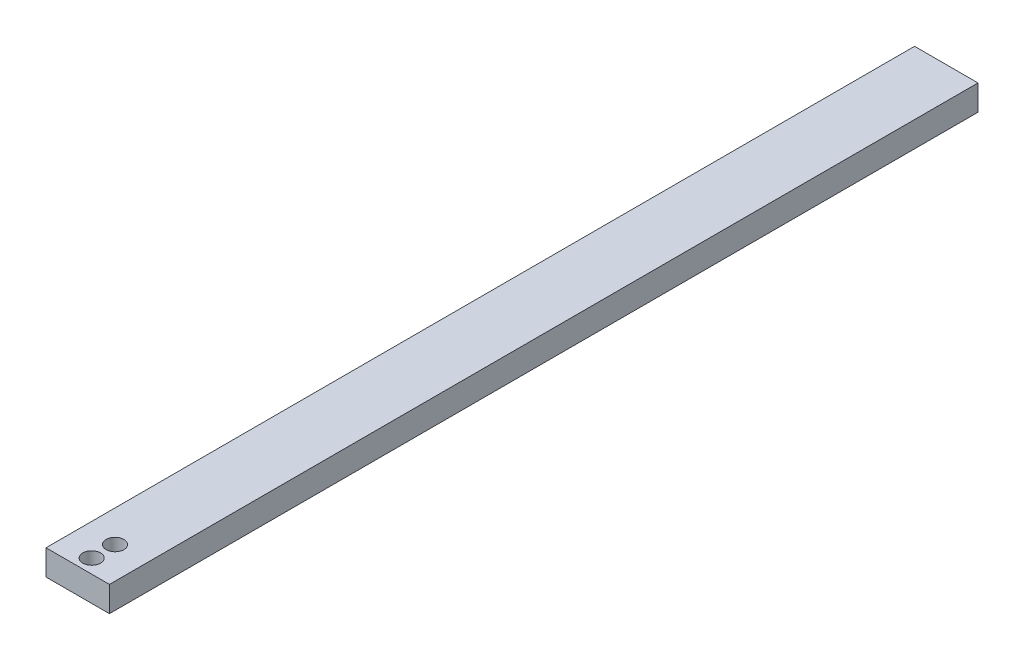
ISO-10303-21;
HEADER;
FILE_DESCRIPTION(('STEP AP214'),'2;1');
FILE_NAME('part.step','',(''),(''),'','','');
FILE_SCHEMA(('AUTOMOTIVE_DESIGN { 1 0 10303 214 1 1 1 1 }'));
ENDSEC;
DATA;
#1=APPLICATION_CONTEXT('core data for automotive mechanical design processes');
#2=APPLICATION_PROTOCOL_DEFINITION('international standard','automotive_design',2000,#1);
#3=PRODUCT_CONTEXT('',#1,'mechanical');
#4=PRODUCT('Part','Part','',(#3));
#5=PRODUCT_RELATED_PRODUCT_CATEGORY('part','',(#4));
#6=PRODUCT_DEFINITION_FORMATION('','',#4);
#7=PRODUCT_DEFINITION_CONTEXT('part definition',#1,'design');
#8=PRODUCT_DEFINITION('design','',#6,#7);
#9=PRODUCT_DEFINITION_SHAPE('','',#8);
#10=(LENGTH_UNIT() NAMED_UNIT(*) SI_UNIT(.MILLI.,.METRE.));
#11=(NAMED_UNIT(*) PLANE_ANGLE_UNIT() SI_UNIT($,.RADIAN.));
#12=(NAMED_UNIT(*) SI_UNIT($,.STERADIAN.) SOLID_ANGLE_UNIT());
#13=UNCERTAINTY_MEASURE_WITH_UNIT(LENGTH_MEASURE(1.E-05),#10,'distance_accuracy_value','');
#14=(GEOMETRIC_REPRESENTATION_CONTEXT(3) GLOBAL_UNCERTAINTY_ASSIGNED_CONTEXT((#13)) GLOBAL_UNIT_ASSIGNED_CONTEXT((#10,
#11,#12)) REPRESENTATION_CONTEXT('',''));
#15=CARTESIAN_POINT('',(0.,0.,0.));
#16=DIRECTION('',(0.,0.,1.));
#17=DIRECTION('',(1.,0.,0.));
#18=AXIS2_PLACEMENT_3D('',#15,#16,#17);
#19=CARTESIAN_POINT('',(-82.2085889570552,28.3742331288343,684.5));
#20=DIRECTION('',(1.,0.,0.));
#21=DIRECTION('',(0.,1.,0.));
#22=AXIS2_PLACEMENT_3D('',#19,#20,#21);
#23=PLANE('',#22);
#24=DIRECTION('',(0.,-1.,0.));
#25=VECTOR('',#24,1.);
#26=CARTESIAN_POINT('',(-82.2085889570552,28.3742331288343,0.));
#27=LINE('',#26,#25);
#28=CARTESIAN_POINT('',(-82.2085889570552,28.3742331288343,0.));
#29=VERTEX_POINT('',#28);
#30=CARTESIAN_POINT('',(-82.2085889570552,8.37423312883434,0.));
#31=VERTEX_POINT('',#30);
#32=EDGE_CURVE('E107',#29,#31,#27,.T.);
#33=ORIENTED_EDGE('',*,*,#32,.T.);
#34=DIRECTION('',(0.,0.,-1.));
#35=VECTOR('',#34,1.);
#36=CARTESIAN_POINT('',(-82.2085889570552,8.37423312883434,684.5));
#37=LINE('',#36,#35);
#38=CARTESIAN_POINT('',(-82.2085889570552,8.37423312883434,684.5));
#39=VERTEX_POINT('',#38);
#40=EDGE_CURVE('E11',#39,#31,#37,.T.);
#41=ORIENTED_EDGE('',*,*,#40,.F.);
#42=DIRECTION('',(0.,-1.,0.));
#43=VECTOR('',#42,1.);
#44=CARTESIAN_POINT('',(-82.2085889570552,28.3742331288343,684.5));
#45=LINE('',#44,#43);
#46=CARTESIAN_POINT('',(-82.2085889570552,28.3742331288343,684.5));
#47=VERTEX_POINT('',#46);
#48=EDGE_CURVE('E94',#47,#39,#45,.T.);
#49=ORIENTED_EDGE('',*,*,#48,.F.);
#50=DIRECTION('',(0.,0.,-1.));
#51=VECTOR('',#50,1.);
#52=CARTESIAN_POINT('',(-82.2085889570552,28.3742331288343,684.5));
#53=LINE('',#52,#51);
#54=EDGE_CURVE('E103',#47,#29,#53,.T.);
#55=ORIENTED_EDGE('',*,*,#54,.T.);
#56=EDGE_LOOP('',(#33,#41,#49,#55));
#57=FACE_BOUND('',#56,.T.);
#58=ADVANCED_FACE('F41',(#57),#23,.F.);
#59=CARTESIAN_POINT('',(-82.2085889570552,8.37423312883434,684.5));
#60=DIRECTION('',(0.,1.,0.));
#61=DIRECTION('',(0.,0.,1.));
#62=AXIS2_PLACEMENT_3D('',#59,#60,#61);
#63=PLANE('',#62);
#64=CARTESIAN_POINT('',(-57.2085889570552,8.37423312883434,673.5));
#65=DIRECTION('',(0.,1.,0.));
#66=DIRECTION('',(0.,0.,1.));
#67=AXIS2_PLACEMENT_3D('',#64,#65,#66);
#68=CIRCLE('',#67,7.);
#69=CARTESIAN_POINT('',(-57.2085889570552,8.37423312883434,680.5));
#70=VERTEX_POINT('',#69);
#71=EDGE_CURVE('E116',#70,#70,#68,.T.);
#72=ORIENTED_EDGE('',*,*,#71,.T.);
#73=EDGE_LOOP('',(#72));
#74=FACE_BOUND('',#73,.T.);
#75=CARTESIAN_POINT('',(-57.2085889570552,8.37423312883434,655.1));
#76=DIRECTION('',(0.,1.,0.));
#77=DIRECTION('',(0.,0.,1.));
#78=AXIS2_PLACEMENT_3D('',#75,#76,#77);
#79=CIRCLE('',#78,7.);
#80=CARTESIAN_POINT('',(-57.2085889570552,8.37423312883434,662.1));
#81=VERTEX_POINT('',#80);
#82=EDGE_CURVE('E121',#81,#81,#79,.T.);
#83=ORIENTED_EDGE('',*,*,#82,.T.);
#84=EDGE_LOOP('',(#83));
#85=FACE_BOUND('',#84,.T.);
#86=DIRECTION('',(1.,0.,0.));
#87=VECTOR('',#86,1.);
#88=CARTESIAN_POINT('',(-82.2085889570552,8.37423312883434,0.));
#89=LINE('',#88,#87);
#90=CARTESIAN_POINT('',(-32.2085889570552,8.37423312883434,0.));
#91=VERTEX_POINT('',#90);
#92=EDGE_CURVE('E98',#31,#91,#89,.T.);
#93=ORIENTED_EDGE('',*,*,#92,.T.);
#94=DIRECTION('',(0.,0.,-1.));
#95=VECTOR('',#94,1.);
#96=CARTESIAN_POINT('',(-32.2085889570552,8.37423312883434,684.5));
#97=LINE('',#96,#95);
#98=CARTESIAN_POINT('',(-32.2085889570552,8.37423312883434,684.5));
#99=VERTEX_POINT('',#98);
#100=EDGE_CURVE('E50',#99,#91,#97,.T.);
#101=ORIENTED_EDGE('',*,*,#100,.F.);
#102=DIRECTION('',(1.,0.,0.));
#103=VECTOR('',#102,1.);
#104=CARTESIAN_POINT('',(-82.2085889570552,8.37423312883434,684.5));
#105=LINE('',#104,#103);
#106=EDGE_CURVE('E89',#39,#99,#105,.T.);
#107=ORIENTED_EDGE('',*,*,#106,.F.);
#108=ORIENTED_EDGE('',*,*,#40,.T.);
#109=EDGE_LOOP('',(#93,#101,#107,#108));
#110=FACE_BOUND('',#109,.T.);
#111=ADVANCED_FACE('F97',(#74,#85,#110),#63,.F.);
#112=CARTESIAN_POINT('',(-32.2085889570552,28.3742331288343,684.5));
#113=DIRECTION('',(-1.,0.,0.));
#114=DIRECTION('',(0.,0.,1.));
#115=AXIS2_PLACEMENT_3D('',#112,#113,#114);
#116=PLANE('',#115);
#117=DIRECTION('',(0.,1.,0.));
#118=VECTOR('',#117,1.);
#119=CARTESIAN_POINT('',(-32.2085889570552,28.3742331288343,0.));
#120=LINE('',#119,#118);
#121=CARTESIAN_POINT('',(-32.2085889570552,28.3742331288343,0.));
#122=VERTEX_POINT('',#121);
#123=EDGE_CURVE('E76',#91,#122,#120,.T.);
#124=ORIENTED_EDGE('',*,*,#123,.T.);
#125=DIRECTION('',(0.,0.,-1.));
#126=VECTOR('',#125,1.);
#127=CARTESIAN_POINT('',(-32.2085889570552,28.3742331288343,684.5));
#128=LINE('',#127,#126);
#129=CARTESIAN_POINT('',(-32.2085889570552,28.3742331288343,684.5));
#130=VERTEX_POINT('',#129);
#131=EDGE_CURVE('E99',#130,#122,#128,.T.);
#132=ORIENTED_EDGE('',*,*,#131,.F.);
#133=DIRECTION('',(0.,1.,0.));
#134=VECTOR('',#133,1.);
#135=CARTESIAN_POINT('',(-32.2085889570552,28.3742331288343,684.5));
#136=LINE('',#135,#134);
#137=EDGE_CURVE('E92',#99,#130,#136,.T.);
#138=ORIENTED_EDGE('',*,*,#137,.F.);
#139=ORIENTED_EDGE('',*,*,#100,.T.);
#140=EDGE_LOOP('',(#124,#132,#138,#139));
#141=FACE_BOUND('',#140,.T.);
#142=ADVANCED_FACE('F101',(#141),#116,.F.);
#143=CARTESIAN_POINT('',(-82.2085889570552,28.3742331288343,684.5));
#144=DIRECTION('',(0.,-1.,0.));
#145=DIRECTION('',(0.,0.,-1.));
#146=AXIS2_PLACEMENT_3D('',#143,#144,#145);
#147=PLANE('',#146);
#148=CARTESIAN_POINT('',(-57.2085889570552,28.3742331288343,673.5));
#149=DIRECTION('',(0.,-1.,0.));
#150=DIRECTION('',(0.,0.,-1.));
#151=AXIS2_PLACEMENT_3D('',#148,#149,#150);
#152=CIRCLE('',#151,7.);
#153=CARTESIAN_POINT('',(-57.2085889570552,28.3742331288343,666.5));
#154=VERTEX_POINT('',#153);
#155=EDGE_CURVE('E44',#154,#154,#152,.T.);
#156=ORIENTED_EDGE('',*,*,#155,.T.);
#157=EDGE_LOOP('',(#156));
#158=FACE_BOUND('',#157,.T.);
#159=CARTESIAN_POINT('',(-57.2085889570552,28.3742331288343,655.1));
#160=DIRECTION('',(0.,-1.,0.));
#161=DIRECTION('',(0.,0.,-1.));
#162=AXIS2_PLACEMENT_3D('',#159,#160,#161);
#163=CIRCLE('',#162,7.);
#164=CARTESIAN_POINT('',(-57.2085889570552,28.3742331288343,648.1));
#165=VERTEX_POINT('',#164);
#166=EDGE_CURVE('E114',#165,#165,#163,.T.);
#167=ORIENTED_EDGE('',*,*,#166,.T.);
#168=EDGE_LOOP('',(#167));
#169=FACE_BOUND('',#168,.T.);
#170=DIRECTION('',(-1.,0.,0.));
#171=VECTOR('',#170,1.);
#172=CARTESIAN_POINT('',(-82.2085889570552,28.3742331288343,0.));
#173=LINE('',#172,#171);
#174=EDGE_CURVE('E82',#122,#29,#173,.T.);
#175=ORIENTED_EDGE('',*,*,#174,.T.);
#176=ORIENTED_EDGE('',*,*,#54,.F.);
#177=DIRECTION('',(-1.,0.,0.));
#178=VECTOR('',#177,1.);
#179=CARTESIAN_POINT('',(-82.2085889570552,28.3742331288343,684.5));
#180=LINE('',#179,#178);
#181=EDGE_CURVE('E59',#130,#47,#180,.T.);
#182=ORIENTED_EDGE('',*,*,#181,.F.);
#183=ORIENTED_EDGE('',*,*,#131,.T.);
#184=EDGE_LOOP('',(#175,#176,#182,#183));
#185=FACE_BOUND('',#184,.T.);
#186=ADVANCED_FACE('F151',(#158,#169,#185),#147,.F.);
#187=CARTESIAN_POINT('',(0.,0.,684.5));
#188=DIRECTION('',(0.,0.,1.));
#189=DIRECTION('',(1.,0.,0.));
#190=AXIS2_PLACEMENT_3D('',#187,#188,#189);
#191=PLANE('',#190);
#192=ORIENTED_EDGE('',*,*,#48,.T.);
#193=ORIENTED_EDGE('',*,*,#106,.T.);
#194=ORIENTED_EDGE('',*,*,#137,.T.);
#195=ORIENTED_EDGE('',*,*,#181,.T.);
#196=EDGE_LOOP('',(#192,#193,#194,#195));
#197=FACE_BOUND('',#196,.T.);
#198=ADVANCED_FACE('F90',(#197),#191,.T.);
#199=CARTESIAN_POINT('',(0.,0.,0.));
#200=DIRECTION('',(0.,0.,1.));
#201=DIRECTION('',(1.,0.,0.));
#202=AXIS2_PLACEMENT_3D('',#199,#200,#201);
#203=PLANE('',#202);
#204=CARTESIAN_POINT('',(-57.2085889570552,18.3742331288343,0.));
#205=DIRECTION('',(0.,0.,-1.));
#206=DIRECTION('',(-1.,0.,0.));
#207=AXIS2_PLACEMENT_3D('',#204,#205,#206);
#208=CIRCLE('',#207,6.99999999999999);
#209=CARTESIAN_POINT('',(-64.2085889570552,18.3742331288343,0.));
#210=VERTEX_POINT('',#209);
#211=EDGE_CURVE('E129',#210,#210,#208,.T.);
#212=ORIENTED_EDGE('',*,*,#211,.F.);
#213=EDGE_LOOP('',(#212));
#214=FACE_BOUND('',#213,.T.);
#215=ORIENTED_EDGE('',*,*,#32,.F.);
#216=ORIENTED_EDGE('',*,*,#174,.F.);
#217=ORIENTED_EDGE('',*,*,#123,.F.);
#218=ORIENTED_EDGE('',*,*,#92,.F.);
#219=EDGE_LOOP('',(#215,#216,#217,#218));
#220=FACE_BOUND('',#219,.T.);
#221=ADVANCED_FACE('F144',(#214,#220),#203,.F.);
#222=CARTESIAN_POINT('',(-57.2085889570552,8.37423312883434,655.1));
#223=DIRECTION('',(0.,1.,0.));
#224=DIRECTION('',(0.,0.,1.));
#225=AXIS2_PLACEMENT_3D('',#222,#223,#224);
#226=CYLINDRICAL_SURFACE('',#225,7.);
#227=ORIENTED_EDGE('',*,*,#82,.F.);
#228=EDGE_LOOP('',(#227));
#229=FACE_BOUND('',#228,.T.);
#230=ORIENTED_EDGE('',*,*,#166,.F.);
#231=EDGE_LOOP('',(#230));
#232=FACE_BOUND('',#231,.T.);
#233=ADVANCED_FACE('F147',(#229,#232),#226,.F.);
#234=CARTESIAN_POINT('',(-57.2085889570552,8.37423312883434,673.5));
#235=DIRECTION('',(0.,1.,0.));
#236=DIRECTION('',(0.,0.,1.));
#237=AXIS2_PLACEMENT_3D('',#234,#235,#236);
#238=CYLINDRICAL_SURFACE('',#237,7.);
#239=ORIENTED_EDGE('',*,*,#71,.F.);
#240=EDGE_LOOP('',(#239));
#241=FACE_BOUND('',#240,.T.);
#242=ORIENTED_EDGE('',*,*,#155,.F.);
#243=EDGE_LOOP('',(#242));
#244=FACE_BOUND('',#243,.T.);
#245=ADVANCED_FACE('F140',(#241,#244),#238,.F.);
#246=CARTESIAN_POINT('',(-57.2085889570552,18.3742331288343,14.));
#247=DIRECTION('',(0.,0.,-1.));
#248=DIRECTION('',(-1.,0.,0.));
#249=AXIS2_PLACEMENT_3D('',#246,#247,#248);
#250=CYLINDRICAL_SURFACE('',#249,6.99999999999999);
#251=CARTESIAN_POINT('',(-57.2085889570552,18.3742331288343,14.));
#252=DIRECTION('',(0.,0.,-1.));
#253=DIRECTION('',(-1.,0.,0.));
#254=AXIS2_PLACEMENT_3D('',#251,#252,#253);
#255=CIRCLE('',#254,6.99999999999999);
#256=CARTESIAN_POINT('',(-64.2085889570552,18.3742331288343,14.));
#257=VERTEX_POINT('',#256);
#258=EDGE_CURVE('E126',#257,#257,#255,.T.);
#259=CARTESIAN_POINT('',(-64.2085889570552,18.3742331288343,14.));
#260=CARTESIAN_POINT('',(-64.2085889570552,18.3742331288343,13.8541666666667));
#261=CARTESIAN_POINT('',(-64.2085889570552,18.3742331288343,13.7083333333333));
#262=CARTESIAN_POINT('',(-64.2085889570552,18.3742331288343,13.4166666666667));
#263=CARTESIAN_POINT('',(-64.2085889570552,18.3742331288343,13.2708333333333));
#264=CARTESIAN_POINT('',(-64.2085889570552,18.3742331288343,12.9791666666667));
#265=CARTESIAN_POINT('',(-64.2085889570552,18.3742331288343,12.8333333333333));
#266=CARTESIAN_POINT('',(-64.2085889570552,18.3742331288343,12.5416666666667));
#267=CARTESIAN_POINT('',(-64.2085889570552,18.3742331288343,12.3958333333333));
#268=CARTESIAN_POINT('',(-64.2085889570552,18.3742331288343,12.1041666666667));
#269=CARTESIAN_POINT('',(-64.2085889570552,18.3742331288343,11.9583333333333));
#270=CARTESIAN_POINT('',(-64.2085889570552,18.3742331288343,11.6666666666667));
#271=CARTESIAN_POINT('',(-64.2085889570552,18.3742331288343,11.5208333333333));
#272=CARTESIAN_POINT('',(-64.2085889570552,18.3742331288343,11.2291666666667));
#273=CARTESIAN_POINT('',(-64.2085889570552,18.3742331288343,11.0833333333333));
#274=CARTESIAN_POINT('',(-64.2085889570552,18.3742331288343,10.7916666666667));
#275=CARTESIAN_POINT('',(-64.2085889570552,18.3742331288343,10.6458333333333));
#276=CARTESIAN_POINT('',(-64.2085889570552,18.3742331288343,10.3541666666667));
#277=CARTESIAN_POINT('',(-64.2085889570552,18.3742331288343,10.2083333333333));
#278=CARTESIAN_POINT('',(-64.2085889570552,18.3742331288343,9.91666666666667));
#279=CARTESIAN_POINT('',(-64.2085889570552,18.3742331288343,9.77083333333333));
#280=CARTESIAN_POINT('',(-64.2085889570552,18.3742331288343,9.47916666666667));
#281=CARTESIAN_POINT('',(-64.2085889570552,18.3742331288343,9.33333333333333));
#282=CARTESIAN_POINT('',(-64.2085889570552,18.3742331288343,9.04166666666667));
#283=CARTESIAN_POINT('',(-64.2085889570552,18.3742331288343,8.89583333333333));
#284=CARTESIAN_POINT('',(-64.2085889570552,18.3742331288343,8.60416666666667));
#285=CARTESIAN_POINT('',(-64.2085889570552,18.3742331288343,8.45833333333333));
#286=CARTESIAN_POINT('',(-64.2085889570552,18.3742331288343,8.16666666666667));
#287=CARTESIAN_POINT('',(-64.2085889570552,18.3742331288343,8.02083333333333));
#288=CARTESIAN_POINT('',(-64.2085889570552,18.3742331288343,7.72916666666667));
#289=CARTESIAN_POINT('',(-64.2085889570552,18.3742331288343,7.58333333333333));
#290=CARTESIAN_POINT('',(-64.2085889570552,18.3742331288343,7.29166666666667));
#291=CARTESIAN_POINT('',(-64.2085889570552,18.3742331288343,7.14583333333333));
#292=CARTESIAN_POINT('',(-64.2085889570552,18.3742331288343,6.85416666666667));
#293=CARTESIAN_POINT('',(-64.2085889570552,18.3742331288343,6.70833333333333));
#294=CARTESIAN_POINT('',(-64.2085889570552,18.3742331288343,6.41666666666667));
#295=CARTESIAN_POINT('',(-64.2085889570552,18.3742331288343,6.27083333333333));
#296=CARTESIAN_POINT('',(-64.2085889570552,18.3742331288343,5.97916666666667));
#297=CARTESIAN_POINT('',(-64.2085889570552,18.3742331288343,5.83333333333333));
#298=CARTESIAN_POINT('',(-64.2085889570552,18.3742331288343,5.54166666666667));
#299=CARTESIAN_POINT('',(-64.2085889570552,18.3742331288343,5.39583333333333));
#300=CARTESIAN_POINT('',(-64.2085889570552,18.3742331288343,5.10416666666667));
#301=CARTESIAN_POINT('',(-64.2085889570552,18.3742331288343,4.95833333333333));
#302=CARTESIAN_POINT('',(-64.2085889570552,18.3742331288343,4.66666666666667));
#303=CARTESIAN_POINT('',(-64.2085889570552,18.3742331288343,4.52083333333333));
#304=CARTESIAN_POINT('',(-64.2085889570552,18.3742331288343,4.22916666666667));
#305=CARTESIAN_POINT('',(-64.2085889570552,18.3742331288343,4.08333333333334));
#306=CARTESIAN_POINT('',(-64.2085889570552,18.3742331288343,3.79166666666667));
#307=CARTESIAN_POINT('',(-64.2085889570552,18.3742331288343,3.64583333333333));
#308=CARTESIAN_POINT('',(-64.2085889570552,18.3742331288343,3.35416666666667));
#309=CARTESIAN_POINT('',(-64.2085889570552,18.3742331288343,3.20833333333333));
#310=CARTESIAN_POINT('',(-64.2085889570552,18.3742331288343,2.91666666666667));
#311=CARTESIAN_POINT('',(-64.2085889570552,18.3742331288343,2.77083333333333));
#312=CARTESIAN_POINT('',(-64.2085889570552,18.3742331288343,2.47916666666667));
#313=CARTESIAN_POINT('',(-64.2085889570552,18.3742331288343,2.33333333333333));
#314=CARTESIAN_POINT('',(-64.2085889570552,18.3742331288343,2.04166666666667));
#315=CARTESIAN_POINT('',(-64.2085889570552,18.3742331288343,1.89583333333334));
#316=CARTESIAN_POINT('',(-64.2085889570552,18.3742331288343,1.60416666666667));
#317=CARTESIAN_POINT('',(-64.2085889570552,18.3742331288343,1.45833333333333));
#318=CARTESIAN_POINT('',(-64.2085889570552,18.3742331288343,1.16666666666667));
#319=CARTESIAN_POINT('',(-64.2085889570552,18.3742331288343,1.02083333333334));
#320=CARTESIAN_POINT('',(-64.2085889570552,18.3742331288343,0.729166666666669));
#321=CARTESIAN_POINT('',(-64.2085889570552,18.3742331288343,0.583333333333336));
#322=CARTESIAN_POINT('',(-64.2085889570552,18.3742331288343,0.291666666666669));
#323=CARTESIAN_POINT('',(-64.2085889570552,18.3742331288343,0.145833333333335));
#324=CARTESIAN_POINT('',(-64.2085889570552,18.3742331288343,0.));
#325=B_SPLINE_CURVE_WITH_KNOTS('',3,(#259,#260,#261,#262,#263,#264,#265,#266,#267,#268,#269,
#270,#271,#272,#273,#274,#275,#276,#277,#278,#279,#280,#281,#282,#283,#284,#285,#286,#287,#288,
#289,#290,#291,#292,#293,#294,#295,#296,#297,#298,#299,#300,#301,#302,#303,#304,#305,#306,#307,
#308,#309,#310,#311,#312,#313,#314,#315,#316,#317,#318,#319,#320,#321,#322,#323,#324),
.UNSPECIFIED.,.F.,.F.,(4,2,2,2,2,2,2,2,2,2,2,2,2,2,2,2,2,2,2,2,2,2,2,2,2,2,2,2,2,2,2,2,4),(0.,
0.437499999999999,0.874999999999999,1.3125,1.75,2.1875,2.625,3.0625,3.5,3.9375,4.375,4.8125,
5.25,5.6875,6.125,6.5625,7.,7.4375,7.875,8.3125,8.75,9.1875,9.625,10.0625,10.5,10.9375,11.375,
11.8125,12.25,12.6875,13.125,13.5625,14.),.UNSPECIFIED.);
#326=EDGE_CURVE('BSEAM137',#257,#210,#325,.T.);
#327=ORIENTED_EDGE('',*,*,#258,.F.);
#328=ORIENTED_EDGE('',*,*,#211,.T.);
#329=ORIENTED_EDGE('',*,*,#326,.T.);
#330=ORIENTED_EDGE('',*,*,#326,.F.);
#331=EDGE_LOOP('',(#327,#329,#328,#330));
#332=FACE_BOUND('',#331,.T.);
#333=ADVANCED_FACE('F137',(#332),#250,.F.);
#334=CARTESIAN_POINT('',(-57.2085889570552,18.3742331288343,14.));
#335=DIRECTION('',(0.,0.,-1.));
#336=DIRECTION('',(-1.,0.,0.));
#337=AXIS2_PLACEMENT_3D('',#334,#335,#336);
#338=PLANE('',#337);
#339=ORIENTED_EDGE('',*,*,#258,.T.);
#340=EDGE_LOOP('',(#339));
#341=FACE_BOUND('',#340,.T.);
#342=ADVANCED_FACE('F135',(#341),#338,.T.);
#343=CLOSED_SHELL('',(#58,#111,#142,#186,#198,#221,#233,#245,#333,#342));
#344=MANIFOLD_SOLID_BREP('B2',#343);
#345=ADVANCED_BREP_SHAPE_REPRESENTATION('',(#18,#344),#14);
#346=SHAPE_DEFINITION_REPRESENTATION(#9,#345);
ENDSEC;
END-ISO-10303-21;
